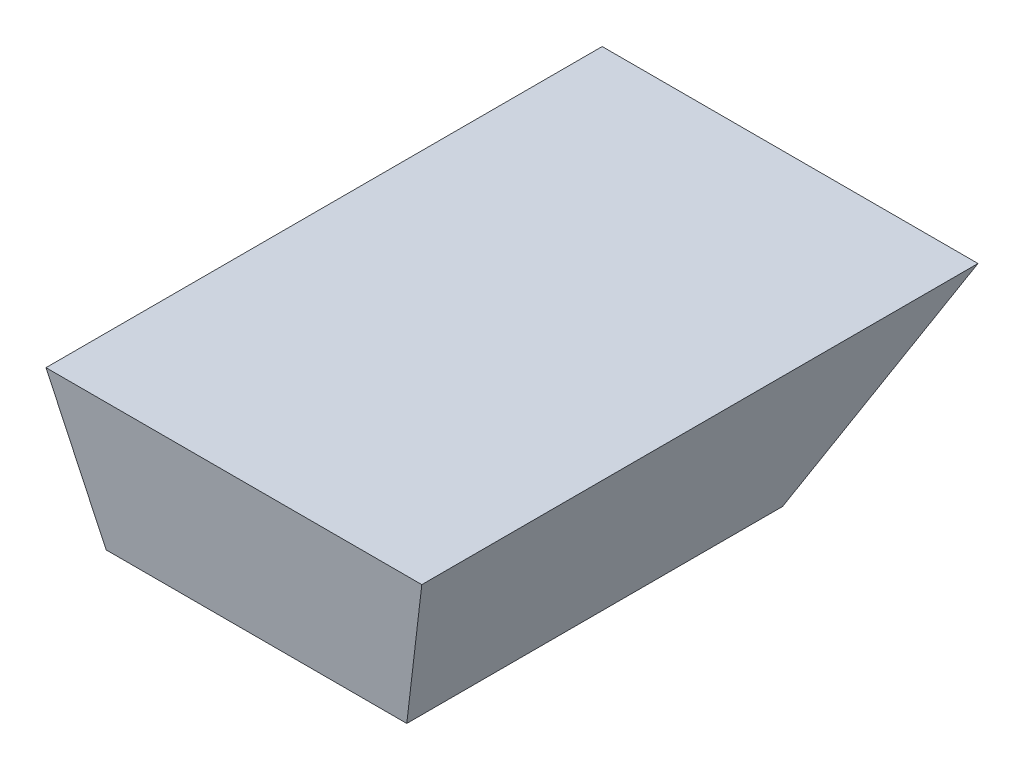
ISO-10303-21;
HEADER;
FILE_DESCRIPTION(('STEP AP214'),'2;1');
FILE_NAME('part.step','',(''),(''),'','','');
FILE_SCHEMA(('AUTOMOTIVE_DESIGN { 1 0 10303 214 1 1 1 1 }'));
ENDSEC;
DATA;
#1=APPLICATION_CONTEXT('core data for automotive mechanical design processes');
#2=APPLICATION_PROTOCOL_DEFINITION('international standard','automotive_design',2000,#1);
#3=PRODUCT_CONTEXT('',#1,'mechanical');
#4=PRODUCT('Part','Part','',(#3));
#5=PRODUCT_RELATED_PRODUCT_CATEGORY('part','',(#4));
#6=PRODUCT_DEFINITION_FORMATION('','',#4);
#7=PRODUCT_DEFINITION_CONTEXT('part definition',#1,'design');
#8=PRODUCT_DEFINITION('design','',#6,#7);
#9=PRODUCT_DEFINITION_SHAPE('','',#8);
#10=(LENGTH_UNIT() NAMED_UNIT(*) SI_UNIT(.MILLI.,.METRE.));
#11=(NAMED_UNIT(*) PLANE_ANGLE_UNIT() SI_UNIT($,.RADIAN.));
#12=(NAMED_UNIT(*) SI_UNIT($,.STERADIAN.) SOLID_ANGLE_UNIT());
#13=UNCERTAINTY_MEASURE_WITH_UNIT(LENGTH_MEASURE(1.E-05),#10,'distance_accuracy_value','');
#14=(GEOMETRIC_REPRESENTATION_CONTEXT(3) GLOBAL_UNCERTAINTY_ASSIGNED_CONTEXT((#13)) GLOBAL_UNIT_ASSIGNED_CONTEXT((#10,
#11,#12)) REPRESENTATION_CONTEXT('',''));
#15=CARTESIAN_POINT('',(0.,0.,0.));
#16=DIRECTION('',(0.,0.,1.));
#17=DIRECTION('',(1.,0.,0.));
#18=AXIS2_PLACEMENT_3D('',#15,#16,#17);
#19=CARTESIAN_POINT('',(-125.,-50.,370.));
#20=DIRECTION('',(0.,1.,0.));
#21=DIRECTION('',(0.,0.,1.));
#22=AXIS2_PLACEMENT_3D('',#19,#20,#21);
#23=PLANE('',#22);
#24=DIRECTION('',(0.,0.,1.));
#25=VECTOR('',#24,1.);
#26=CARTESIAN_POINT('',(-100.,-50.,0.));
#27=LINE('',#26,#25);
#28=CARTESIAN_POINT('',(-100.,-50.,105.));
#29=VERTEX_POINT('',#28);
#30=CARTESIAN_POINT('',(-100.,-50.,355.));
#31=VERTEX_POINT('',#30);
#32=EDGE_CURVE('E96',#29,#31,#27,.T.);
#33=ORIENTED_EDGE('',*,*,#32,.F.);
#34=DIRECTION('',(-1.,0.,0.));
#35=VECTOR('',#34,1.);
#36=CARTESIAN_POINT('',(125.,-50.,105.));
#37=LINE('',#36,#35);
#38=CARTESIAN_POINT('',(100.,-50.,105.));
#39=VERTEX_POINT('',#38);
#40=EDGE_CURVE('E77',#39,#29,#37,.T.);
#41=ORIENTED_EDGE('',*,*,#40,.F.);
#42=DIRECTION('',(0.,0.,1.));
#43=VECTOR('',#42,1.);
#44=CARTESIAN_POINT('',(100.,-50.,0.));
#45=LINE('',#44,#43);
#46=CARTESIAN_POINT('',(100.,-50.,355.));
#47=VERTEX_POINT('',#46);
#48=EDGE_CURVE('E49',#39,#47,#45,.T.);
#49=ORIENTED_EDGE('',*,*,#48,.T.);
#50=DIRECTION('',(-1.,0.,0.));
#51=VECTOR('',#50,1.);
#52=CARTESIAN_POINT('',(125.,-50.,355.));
#53=LINE('',#52,#51);
#54=EDGE_CURVE('E80',#47,#31,#53,.T.);
#55=ORIENTED_EDGE('',*,*,#54,.T.);
#56=EDGE_LOOP('',(#33,#41,#49,#55));
#57=FACE_BOUND('',#56,.T.);
#58=ADVANCED_FACE('F35',(#57),#23,.F.);
#59=CARTESIAN_POINT('',(-125.,50.,370.));
#60=DIRECTION('',(0.,-1.,0.));
#61=DIRECTION('',(0.,0.,-1.));
#62=AXIS2_PLACEMENT_3D('',#59,#60,#61);
#63=PLANE('',#62);
#64=DIRECTION('',(-1.,0.,0.));
#65=VECTOR('',#64,1.);
#66=CARTESIAN_POINT('',(-125.,50.,0.));
#67=LINE('',#66,#65);
#68=CARTESIAN_POINT('',(125.,50.,0.));
#69=VERTEX_POINT('',#68);
#70=CARTESIAN_POINT('',(-125.,50.,0.));
#71=VERTEX_POINT('',#70);
#72=EDGE_CURVE('E57',#69,#71,#67,.T.);
#73=ORIENTED_EDGE('',*,*,#72,.T.);
#74=DIRECTION('',(0.,0.,-1.));
#75=VECTOR('',#74,1.);
#76=CARTESIAN_POINT('',(-125.,50.,370.));
#77=LINE('',#76,#75);
#78=CARTESIAN_POINT('',(-125.,50.,370.));
#79=VERTEX_POINT('',#78);
#80=EDGE_CURVE('E84',#79,#71,#77,.T.);
#81=ORIENTED_EDGE('',*,*,#80,.F.);
#82=DIRECTION('',(-1.,0.,0.));
#83=VECTOR('',#82,1.);
#84=CARTESIAN_POINT('',(-125.,50.,370.));
#85=LINE('',#84,#83);
#86=CARTESIAN_POINT('',(125.,50.,370.));
#87=VERTEX_POINT('',#86);
#88=EDGE_CURVE('E91',#87,#79,#85,.T.);
#89=ORIENTED_EDGE('',*,*,#88,.F.);
#90=DIRECTION('',(0.,0.,-1.));
#91=VECTOR('',#90,1.);
#92=CARTESIAN_POINT('',(125.,50.,370.));
#93=LINE('',#92,#91);
#94=EDGE_CURVE('E90',#87,#69,#93,.T.);
#95=ORIENTED_EDGE('',*,*,#94,.T.);
#96=EDGE_LOOP('',(#73,#81,#89,#95));
#97=FACE_BOUND('',#96,.T.);
#98=ADVANCED_FACE('F94',(#97),#63,.F.);
#99=CARTESIAN_POINT('',(-125.,50.,0.));
#100=DIRECTION('',(0.970142500145332,0.242535625036333,0.));
#101=DIRECTION('',(-0.242535625036333,0.970142500145332,0.));
#102=AXIS2_PLACEMENT_3D('',#99,#100,#101);
#103=PLANE('',#102);
#104=ORIENTED_EDGE('',*,*,#80,.T.);
#105=DIRECTION('',(0.169906916507646,-0.679627666030585,0.713609049332114));
#106=VECTOR('',#105,1.);
#107=CARTESIAN_POINT('',(-125.,50.,0.));
#108=LINE('',#107,#106);
#109=EDGE_CURVE('E74',#71,#29,#108,.T.);
#110=ORIENTED_EDGE('',*,*,#109,.T.);
#111=ORIENTED_EDGE('',*,*,#32,.T.);
#112=DIRECTION('',(-0.24000768036866,0.960030721474639,0.144004608221196));
#113=VECTOR('',#112,1.);
#114=CARTESIAN_POINT('',(-112.21198156682,-1.15207373271894,362.327188940092));
#115=LINE('',#114,#113);
#116=EDGE_CURVE('E87',#31,#79,#115,.T.);
#117=ORIENTED_EDGE('',*,*,#116,.T.);
#118=EDGE_LOOP('',(#104,#110,#111,#117));
#119=FACE_BOUND('',#118,.T.);
#120=ADVANCED_FACE('F85',(#119),#103,.F.);
#121=CARTESIAN_POINT('',(100.,-50.,0.));
#122=DIRECTION('',(-0.970142500145332,0.242535625036333,0.));
#123=DIRECTION('',(-0.242535625036333,-0.970142500145332,0.));
#124=AXIS2_PLACEMENT_3D('',#121,#122,#123);
#125=PLANE('',#124);
#126=ORIENTED_EDGE('',*,*,#48,.F.);
#127=DIRECTION('',(0.169906916507646,0.679627666030585,-0.713609049332114));
#128=VECTOR('',#127,1.);
#129=CARTESIAN_POINT('',(112.730946882217,0.92378752886834,51.5300230946882));
#130=LINE('',#129,#128);
#131=EDGE_CURVE('E11',#39,#69,#130,.T.);
#132=ORIENTED_EDGE('',*,*,#131,.T.);
#133=ORIENTED_EDGE('',*,*,#94,.F.);
#134=DIRECTION('',(-0.24000768036866,-0.960030721474639,-0.144004608221196));
#135=VECTOR('',#134,1.);
#136=CARTESIAN_POINT('',(87.7304147465438,-99.0783410138249,347.638248847926));
#137=LINE('',#136,#135);
#138=EDGE_CURVE('E42',#87,#47,#137,.T.);
#139=ORIENTED_EDGE('',*,*,#138,.T.);
#140=EDGE_LOOP('',(#126,#132,#133,#139));
#141=FACE_BOUND('',#140,.T.);
#142=ADVANCED_FACE('F103',(#141),#125,.F.);
#143=CARTESIAN_POINT('',(125.,50.,370.));
#144=DIRECTION('',(0.,0.148340452930245,-0.988936352868298));
#145=DIRECTION('',(0.,0.988936352868298,0.148340452930245));
#146=AXIS2_PLACEMENT_3D('',#143,#144,#145);
#147=PLANE('',#146);
#148=ORIENTED_EDGE('',*,*,#54,.F.);
#149=ORIENTED_EDGE('',*,*,#138,.F.);
#150=ORIENTED_EDGE('',*,*,#88,.T.);
#151=ORIENTED_EDGE('',*,*,#116,.F.);
#152=EDGE_LOOP('',(#148,#149,#150,#151));
#153=FACE_BOUND('',#152,.T.);
#154=ADVANCED_FACE('F105',(#153),#147,.F.);
#155=CARTESIAN_POINT('',(125.,50.,0.));
#156=DIRECTION('',(0.,0.724137931034483,0.689655172413793));
#157=DIRECTION('',(0.,-0.689655172413793,0.724137931034483));
#158=AXIS2_PLACEMENT_3D('',#155,#156,#157);
#159=PLANE('',#158);
#160=ORIENTED_EDGE('',*,*,#72,.F.);
#161=ORIENTED_EDGE('',*,*,#131,.F.);
#162=ORIENTED_EDGE('',*,*,#40,.T.);
#163=ORIENTED_EDGE('',*,*,#109,.F.);
#164=EDGE_LOOP('',(#160,#161,#162,#163));
#165=FACE_BOUND('',#164,.T.);
#166=ADVANCED_FACE('F76',(#165),#159,.F.);
#167=CLOSED_SHELL('',(#58,#98,#120,#142,#154,#166));
#168=MANIFOLD_SOLID_BREP('B2',#167);
#169=ADVANCED_BREP_SHAPE_REPRESENTATION('',(#18,#168),#14);
#170=SHAPE_DEFINITION_REPRESENTATION(#9,#169);
ENDSEC;
END-ISO-10303-21;
